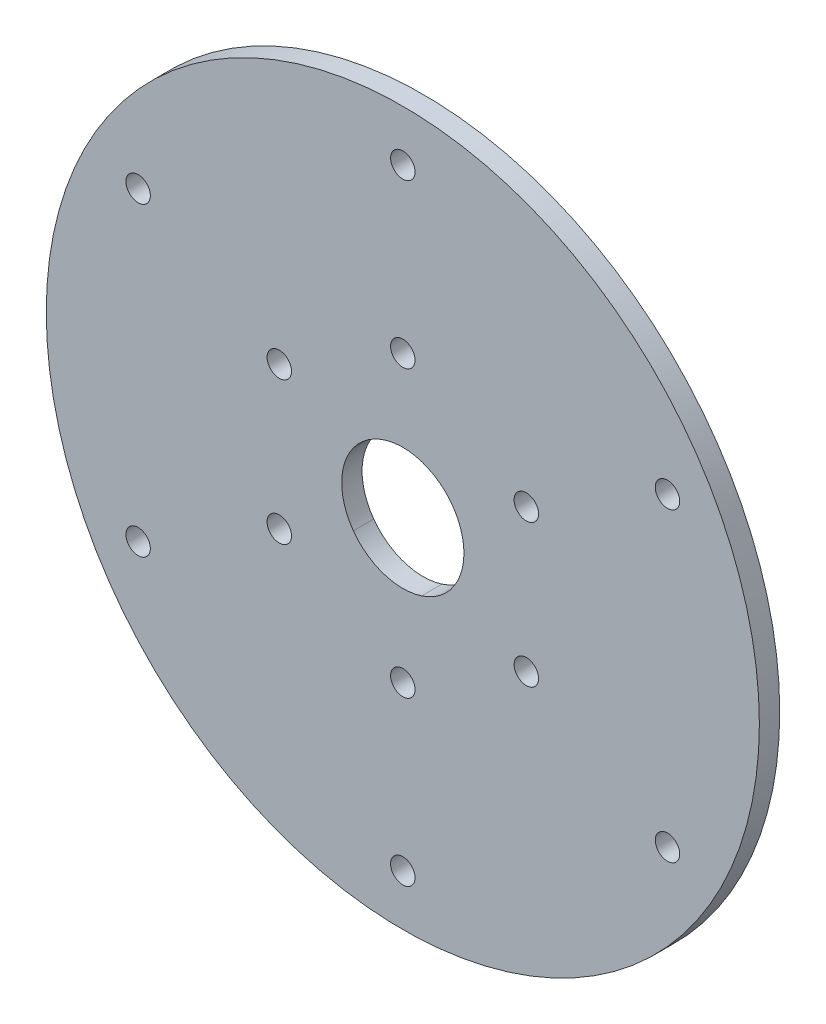
ISO-10303-21;
HEADER;
FILE_DESCRIPTION(('STEP AP214'),'2;1');
FILE_NAME('part.step','',(''),(''),'','','');
FILE_SCHEMA(('AUTOMOTIVE_DESIGN { 1 0 10303 214 1 1 1 1 }'));
ENDSEC;
DATA;
#1=APPLICATION_CONTEXT('core data for automotive mechanical design processes');
#2=APPLICATION_PROTOCOL_DEFINITION('international standard','automotive_design',2000,#1);
#3=PRODUCT_CONTEXT('',#1,'mechanical');
#4=PRODUCT('Part','Part','',(#3));
#5=PRODUCT_RELATED_PRODUCT_CATEGORY('part','',(#4));
#6=PRODUCT_DEFINITION_FORMATION('','',#4);
#7=PRODUCT_DEFINITION_CONTEXT('part definition',#1,'design');
#8=PRODUCT_DEFINITION('design','',#6,#7);
#9=PRODUCT_DEFINITION_SHAPE('','',#8);
#10=(LENGTH_UNIT() NAMED_UNIT(*) SI_UNIT(.MILLI.,.METRE.));
#11=(NAMED_UNIT(*) PLANE_ANGLE_UNIT() SI_UNIT($,.RADIAN.));
#12=(NAMED_UNIT(*) SI_UNIT($,.STERADIAN.) SOLID_ANGLE_UNIT());
#13=UNCERTAINTY_MEASURE_WITH_UNIT(LENGTH_MEASURE(1.E-05),#10,'distance_accuracy_value','');
#14=(GEOMETRIC_REPRESENTATION_CONTEXT(3) GLOBAL_UNCERTAINTY_ASSIGNED_CONTEXT((#13)) GLOBAL_UNIT_ASSIGNED_CONTEXT((#10,
#11,#12)) REPRESENTATION_CONTEXT('',''));
#15=CARTESIAN_POINT('',(0.,0.,0.));
#16=DIRECTION('',(0.,0.,1.));
#17=DIRECTION('',(1.,0.,0.));
#18=AXIS2_PLACEMENT_3D('',#15,#16,#17);
#19=CARTESIAN_POINT('',(0.00111803398874989,0.000363271264002675,10.));
#20=DIRECTION('',(0.,0.,-1.));
#21=DIRECTION('',(-1.,0.,0.));
#22=AXIS2_PLACEMENT_3D('',#19,#20,#21);
#23=CYLINDRICAL_SURFACE('',#22,30.);
#24=CARTESIAN_POINT('',(0.00111803398874989,0.000363271264002675,0.));
#25=DIRECTION('',(0.,0.,1.));
#26=DIRECTION('',(1.,0.,0.));
#27=AXIS2_PLACEMENT_3D('',#24,#25,#26);
#28=CIRCLE('',#27,30.);
#29=CARTESIAN_POINT('',(9.27106884637913,-28.5315138477736,0.));
#30=VERTEX_POINT('',#29);
#31=CARTESIAN_POINT('',(30.0011180282306,0.000951056604623031,0.));
#32=VERTEX_POINT('',#31);
#33=EDGE_CURVE('E124',#30,#32,#28,.T.);
#34=ORIENTED_EDGE('',*,*,#33,.F.);
#35=DIRECTION('',(0.,0.,-1.));
#36=VECTOR('',#35,1.);
#37=CARTESIAN_POINT('',(9.27106884637913,-28.5315138477736,10.));
#38=LINE('',#37,#36);
#39=CARTESIAN_POINT('',(9.27106884637913,-28.5315138477736,10.));
#40=VERTEX_POINT('',#39);
#41=EDGE_CURVE('E11',#40,#30,#38,.T.);
#42=ORIENTED_EDGE('',*,*,#41,.F.);
#43=CARTESIAN_POINT('',(0.00111803398874989,0.000363271264002675,10.));
#44=DIRECTION('',(0.,0.,1.));
#45=DIRECTION('',(1.,0.,0.));
#46=AXIS2_PLACEMENT_3D('',#43,#44,#45);
#47=CIRCLE('',#46,30.);
#48=CARTESIAN_POINT('',(30.0011180282306,0.000951056604623031,10.));
#49=VERTEX_POINT('',#48);
#50=EDGE_CURVE('E145',#40,#49,#47,.T.);
#51=ORIENTED_EDGE('',*,*,#50,.T.);
#52=DIRECTION('',(0.,0.,-1.));
#53=VECTOR('',#52,1.);
#54=CARTESIAN_POINT('',(30.0011180282306,0.000951056604623031,10.));
#55=LINE('',#54,#53);
#56=EDGE_CURVE('E58',#49,#32,#55,.T.);
#57=ORIENTED_EDGE('',*,*,#56,.T.);
#58=EDGE_LOOP('',(#34,#42,#51,#57));
#59=FACE_BOUND('',#58,.T.);
#60=ADVANCED_FACE('F41',(#59),#23,.F.);
#61=CARTESIAN_POINT('',(0.,0.,10.));
#62=DIRECTION('',(0.,0.,-1.));
#63=DIRECTION('',(-1.,0.,0.));
#64=AXIS2_PLACEMENT_3D('',#61,#62,#63);
#65=CYLINDRICAL_SURFACE('',#64,30.);
#66=CARTESIAN_POINT('',(0.,0.,0.));
#67=DIRECTION('',(0.,0.,1.));
#68=DIRECTION('',(1.,0.,0.));
#69=AXIS2_PLACEMENT_3D('',#66,#67,#68);
#70=CIRCLE('',#69,30.);
#71=CARTESIAN_POINT('',(-24.2708553180407,-17.6330820372031,0.));
#72=VERTEX_POINT('',#71);
#73=EDGE_CURVE('E127',#72,#30,#70,.T.);
#74=ORIENTED_EDGE('',*,*,#73,.F.);
#75=DIRECTION('',(0.,0.,-1.));
#76=VECTOR('',#75,1.);
#77=CARTESIAN_POINT('',(-24.2708553180407,-17.6330820372031,10.));
#78=LINE('',#77,#76);
#79=CARTESIAN_POINT('',(-24.2708553180407,-17.6330820372031,10.));
#80=VERTEX_POINT('',#79);
#81=EDGE_CURVE('E50',#80,#72,#78,.T.);
#82=ORIENTED_EDGE('',*,*,#81,.F.);
#83=CARTESIAN_POINT('',(0.,0.,10.));
#84=DIRECTION('',(0.,0.,1.));
#85=DIRECTION('',(1.,0.,0.));
#86=AXIS2_PLACEMENT_3D('',#83,#84,#85);
#87=CIRCLE('',#86,30.);
#88=EDGE_CURVE('E109',#80,#40,#87,.T.);
#89=ORIENTED_EDGE('',*,*,#88,.T.);
#90=ORIENTED_EDGE('',*,*,#41,.T.);
#91=EDGE_LOOP('',(#74,#82,#89,#90));
#92=FACE_BOUND('',#91,.T.);
#93=ADVANCED_FACE('F152',(#92),#65,.F.);
#94=CARTESIAN_POINT('',(-0.000690983005625056,0.000951056516295156,10.));
#95=DIRECTION('',(0.,0.,-1.));
#96=DIRECTION('',(-1.,0.,0.));
#97=AXIS2_PLACEMENT_3D('',#94,#95,#96);
#98=CYLINDRICAL_SURFACE('',#97,30.);
#99=CARTESIAN_POINT('',(-0.000690983005625056,0.000951056516295156,0.));
#100=DIRECTION('',(0.,0.,1.));
#101=DIRECTION('',(1.,0.,0.));
#102=AXIS2_PLACEMENT_3D('',#99,#100,#101);
#103=CIRCLE('',#102,30.);
#104=CARTESIAN_POINT('',(-24.2708553180927,17.6349841501641,0.));
#105=VERTEX_POINT('',#104);
#106=EDGE_CURVE('E95',#105,#72,#103,.T.);
#107=ORIENTED_EDGE('',*,*,#106,.F.);
#108=DIRECTION('',(0.,0.,-1.));
#109=VECTOR('',#108,1.);
#110=CARTESIAN_POINT('',(-24.2708553180927,17.6349841501641,10.));
#111=LINE('',#110,#109);
#112=CARTESIAN_POINT('',(-24.2708553180927,17.6349841501641,10.));
#113=VERTEX_POINT('',#112);
#114=EDGE_CURVE('E90',#113,#105,#111,.T.);
#115=ORIENTED_EDGE('',*,*,#114,.F.);
#116=CARTESIAN_POINT('',(-0.000690983005625056,0.000951056516295156,10.));
#117=DIRECTION('',(0.,0.,1.));
#118=DIRECTION('',(1.,0.,0.));
#119=AXIS2_PLACEMENT_3D('',#116,#117,#118);
#120=CIRCLE('',#119,30.);
#121=EDGE_CURVE('E93',#113,#80,#120,.T.);
#122=ORIENTED_EDGE('',*,*,#121,.T.);
#123=ORIENTED_EDGE('',*,*,#81,.T.);
#124=EDGE_LOOP('',(#107,#115,#122,#123));
#125=FACE_BOUND('',#124,.T.);
#126=ADVANCED_FACE('F92',(#125),#98,.F.);
#127=CARTESIAN_POINT('',(0.,0.00190211303259031,10.));
#128=DIRECTION('',(0.,0.,-1.));
#129=DIRECTION('',(-1.,0.,0.));
#130=AXIS2_PLACEMENT_3D('',#127,#128,#129);
#131=CYLINDRICAL_SURFACE('',#130,30.);
#132=CARTESIAN_POINT('',(0.,0.00190211303259031,0.));
#133=DIRECTION('',(0.,0.,1.));
#134=DIRECTION('',(1.,0.,0.));
#135=AXIS2_PLACEMENT_3D('',#132,#133,#134);
#136=CIRCLE('',#135,30.);
#137=CARTESIAN_POINT('',(9.27106884654775,28.5334159607514,0.));
#138=VERTEX_POINT('',#137);
#139=EDGE_CURVE('E134',#138,#105,#136,.T.);
#140=ORIENTED_EDGE('',*,*,#139,.F.);
#141=DIRECTION('',(0.,0.,-1.));
#142=VECTOR('',#141,1.);
#143=CARTESIAN_POINT('',(9.27106884654775,28.5334159607514,10.));
#144=LINE('',#143,#142);
#145=CARTESIAN_POINT('',(9.27106884654775,28.5334159607514,10.));
#146=VERTEX_POINT('',#145);
#147=EDGE_CURVE('E74',#146,#138,#144,.T.);
#148=ORIENTED_EDGE('',*,*,#147,.F.);
#149=CARTESIAN_POINT('',(0.,0.00190211303259031,10.));
#150=DIRECTION('',(0.,0.,1.));
#151=DIRECTION('',(1.,0.,0.));
#152=AXIS2_PLACEMENT_3D('',#149,#150,#151);
#153=CIRCLE('',#152,30.);
#154=EDGE_CURVE('E107',#146,#113,#153,.T.);
#155=ORIENTED_EDGE('',*,*,#154,.T.);
#156=ORIENTED_EDGE('',*,*,#114,.T.);
#157=EDGE_LOOP('',(#140,#148,#155,#156));
#158=FACE_BOUND('',#157,.T.);
#159=ADVANCED_FACE('F112',(#158),#131,.F.);
#160=CARTESIAN_POINT('',(0.0011180339887499,0.00153884176858762,10.));
#161=DIRECTION('',(0.,0.,-1.));
#162=DIRECTION('',(-1.,0.,0.));
#163=AXIS2_PLACEMENT_3D('',#160,#161,#162);
#164=CYLINDRICAL_SURFACE('',#163,30.);
#165=CARTESIAN_POINT('',(0.0011180339887499,0.00153884176858762,0.));
#166=DIRECTION('',(0.,0.,1.));
#167=DIRECTION('',(1.,0.,0.));
#168=AXIS2_PLACEMENT_3D('',#165,#166,#167);
#169=CIRCLE('',#168,30.);
#170=EDGE_CURVE('E137',#32,#138,#169,.T.);
#171=ORIENTED_EDGE('',*,*,#170,.F.);
#172=ORIENTED_EDGE('',*,*,#56,.F.);
#173=CARTESIAN_POINT('',(0.0011180339887499,0.00153884176858762,10.));
#174=DIRECTION('',(0.,0.,1.));
#175=DIRECTION('',(1.,0.,0.));
#176=AXIS2_PLACEMENT_3D('',#173,#174,#175);
#177=CIRCLE('',#176,30.);
#178=EDGE_CURVE('E114',#49,#146,#177,.T.);
#179=ORIENTED_EDGE('',*,*,#178,.T.);
#180=ORIENTED_EDGE('',*,*,#147,.T.);
#181=EDGE_LOOP('',(#171,#172,#179,#180));
#182=FACE_BOUND('',#181,.T.);
#183=ADVANCED_FACE('F156',(#182),#164,.F.);
#184=CARTESIAN_POINT('',(0.,0.,10.));
#185=DIRECTION('',(0.,0.,-1.));
#186=DIRECTION('',(-1.,0.,0.));
#187=AXIS2_PLACEMENT_3D('',#184,#185,#186);
#188=CYLINDRICAL_SURFACE('',#187,175.);
#189=CARTESIAN_POINT('',(0.,0.,10.));
#190=DIRECTION('',(0.,0.,1.));
#191=DIRECTION('',(1.,0.,0.));
#192=AXIS2_PLACEMENT_3D('',#189,#190,#191);
#193=CIRCLE('',#192,175.);
#194=CARTESIAN_POINT('',(175.,0.,10.));
#195=VERTEX_POINT('',#194);
#196=EDGE_CURVE('E117',#195,#195,#193,.T.);
#197=ORIENTED_EDGE('',*,*,#196,.F.);
#198=EDGE_LOOP('',(#197));
#199=FACE_BOUND('',#198,.T.);
#200=CARTESIAN_POINT('',(0.,0.,0.));
#201=DIRECTION('',(0.,0.,1.));
#202=DIRECTION('',(1.,0.,0.));
#203=AXIS2_PLACEMENT_3D('',#200,#201,#202);
#204=CIRCLE('',#203,175.);
#205=CARTESIAN_POINT('',(175.,0.,0.));
#206=VERTEX_POINT('',#205);
#207=EDGE_CURVE('E141',#206,#206,#204,.T.);
#208=ORIENTED_EDGE('',*,*,#207,.T.);
#209=EDGE_LOOP('',(#208));
#210=FACE_BOUND('',#209,.T.);
#211=ADVANCED_FACE('F158',(#199,#210),#188,.T.);
#212=CARTESIAN_POINT('',(0.,0.,10.));
#213=DIRECTION('',(0.,0.,1.));
#214=DIRECTION('',(1.,0.,0.));
#215=AXIS2_PLACEMENT_3D('',#212,#213,#214);
#216=PLANE('',#215);
#217=CARTESIAN_POINT('',(0.,-150.,10.));
#218=DIRECTION('',(0.,0.,-1.));
#219=DIRECTION('',(1.,0.,0.));
#220=AXIS2_PLACEMENT_3D('',#217,#218,#219);
#221=CIRCLE('',#220,6.00000000000001);
#222=CARTESIAN_POINT('',(6.00000000000001,-150.,10.));
#223=VERTEX_POINT('',#222);
#224=EDGE_CURVE('E336',#223,#223,#221,.T.);
#225=ORIENTED_EDGE('',*,*,#224,.T.);
#226=EDGE_LOOP('',(#225));
#227=FACE_BOUND('',#226,.T.);
#228=CARTESIAN_POINT('',(60.621778264911,-34.9999999999994,10.));
#229=DIRECTION('',(0.,0.,-1.));
#230=DIRECTION('',(0.499999999999992,0.866025403784443,0.));
#231=AXIS2_PLACEMENT_3D('',#228,#229,#230);
#232=CIRCLE('',#231,6.00000000000001);
#233=CARTESIAN_POINT('',(63.621778264911,-29.8038475772928,10.));
#234=VERTEX_POINT('',#233);
#235=EDGE_CURVE('E341',#234,#234,#232,.T.);
#236=ORIENTED_EDGE('',*,*,#235,.T.);
#237=EDGE_LOOP('',(#236));
#238=FACE_BOUND('',#237,.T.);
#239=CARTESIAN_POINT('',(129.903810567667,-74.9999999999988,10.));
#240=DIRECTION('',(0.,0.,-1.));
#241=DIRECTION('',(0.499999999999992,0.866025403784443,0.));
#242=AXIS2_PLACEMENT_3D('',#239,#240,#241);
#243=CIRCLE('',#242,6.00000000000001);
#244=CARTESIAN_POINT('',(132.903810567666,-69.8038475772921,10.));
#245=VERTEX_POINT('',#244);
#246=EDGE_CURVE('E355',#245,#245,#243,.T.);
#247=ORIENTED_EDGE('',*,*,#246,.T.);
#248=EDGE_LOOP('',(#247));
#249=FACE_BOUND('',#248,.T.);
#250=CARTESIAN_POINT('',(60.6217782649103,35.0000000000007,10.));
#251=DIRECTION('',(0.,0.,-1.));
#252=DIRECTION('',(-0.50000000000001,0.866025403784433,0.));
#253=AXIS2_PLACEMENT_3D('',#250,#251,#252);
#254=CIRCLE('',#253,6.00000000000001);
#255=CARTESIAN_POINT('',(57.6217782649102,40.1961524227073,10.));
#256=VERTEX_POINT('',#255);
#257=EDGE_CURVE('E457',#256,#256,#254,.T.);
#258=ORIENTED_EDGE('',*,*,#257,.T.);
#259=EDGE_LOOP('',(#258));
#260=FACE_BOUND('',#259,.T.);
#261=CARTESIAN_POINT('',(129.903810567665,75.0000000000015,10.));
#262=DIRECTION('',(0.,0.,-1.));
#263=DIRECTION('',(-0.50000000000001,0.866025403784433,0.));
#264=AXIS2_PLACEMENT_3D('',#261,#262,#263);
#265=CIRCLE('',#264,6.00000000000001);
#266=CARTESIAN_POINT('',(126.903810567665,80.1961524227081,10.));
#267=VERTEX_POINT('',#266);
#268=EDGE_CURVE('E467',#267,#267,#265,.T.);
#269=ORIENTED_EDGE('',*,*,#268,.T.);
#270=EDGE_LOOP('',(#269));
#271=FACE_BOUND('',#270,.T.);
#272=CARTESIAN_POINT('',(0.,-70.,10.));
#273=DIRECTION('',(0.,0.,-1.));
#274=DIRECTION('',(1.,0.,0.));
#275=AXIS2_PLACEMENT_3D('',#272,#273,#274);
#276=CIRCLE('',#275,6.00000000000001);
#277=CARTESIAN_POINT('',(6.00000000000001,-70.,10.));
#278=VERTEX_POINT('',#277);
#279=EDGE_CURVE('E381',#278,#278,#276,.T.);
#280=ORIENTED_EDGE('',*,*,#279,.T.);
#281=EDGE_LOOP('',(#280));
#282=FACE_BOUND('',#281,.T.);
#283=CARTESIAN_POINT('',(-129.903810567665,-75.0000000000006,10.));
#284=DIRECTION('',(0.,0.,-1.));
#285=DIRECTION('',(0.500000000000004,-0.866025403784436,0.));
#286=AXIS2_PLACEMENT_3D('',#283,#284,#285);
#287=CIRCLE('',#286,6.00000000000001);
#288=CARTESIAN_POINT('',(-126.903810567665,-80.1961524227073,10.));
#289=VERTEX_POINT('',#288);
#290=EDGE_CURVE('E373',#289,#289,#287,.T.);
#291=ORIENTED_EDGE('',*,*,#290,.T.);
#292=EDGE_LOOP('',(#291));
#293=FACE_BOUND('',#292,.T.);
#294=CARTESIAN_POINT('',(-60.6217782649106,-35.0000000000003,10.));
#295=DIRECTION('',(0.,0.,-1.));
#296=DIRECTION('',(0.500000000000004,-0.866025403784436,0.));
#297=AXIS2_PLACEMENT_3D('',#294,#295,#296);
#298=CIRCLE('',#297,6.00000000000001);
#299=CARTESIAN_POINT('',(-57.6217782649105,-40.1961524227069,10.));
#300=VERTEX_POINT('',#299);
#301=EDGE_CURVE('E365',#300,#300,#298,.T.);
#302=ORIENTED_EDGE('',*,*,#301,.T.);
#303=EDGE_LOOP('',(#302));
#304=FACE_BOUND('',#303,.T.);
#305=CARTESIAN_POINT('',(-129.903810567666,74.9999999999997,10.));
#306=DIRECTION('',(0.,0.,-1.));
#307=DIRECTION('',(-0.499999999999998,-0.86602540378444,0.));
#308=AXIS2_PLACEMENT_3D('',#305,#306,#307);
#309=CIRCLE('',#308,6.00000000000001);
#310=CARTESIAN_POINT('',(-132.903810567666,69.8038475772931,10.));
#311=VERTEX_POINT('',#310);
#312=EDGE_CURVE('E356',#311,#311,#309,.T.);
#313=ORIENTED_EDGE('',*,*,#312,.T.);
#314=EDGE_LOOP('',(#313));
#315=FACE_BOUND('',#314,.T.);
#316=CARTESIAN_POINT('',(-60.6217782649108,34.9999999999999,10.));
#317=DIRECTION('',(0.,0.,-1.));
#318=DIRECTION('',(-0.499999999999998,-0.86602540378444,0.));
#319=AXIS2_PLACEMENT_3D('',#316,#317,#318);
#320=CIRCLE('',#319,6.00000000000001);
#321=CARTESIAN_POINT('',(-63.6217782649108,29.8038475772932,10.));
#322=VERTEX_POINT('',#321);
#323=EDGE_CURVE('E388',#322,#322,#320,.T.);
#324=ORIENTED_EDGE('',*,*,#323,.T.);
#325=EDGE_LOOP('',(#324));
#326=FACE_BOUND('',#325,.T.);
#327=CARTESIAN_POINT('',(0.,150.,10.));
#328=DIRECTION('',(0.,0.,-1.));
#329=DIRECTION('',(-1.,0.,0.));
#330=AXIS2_PLACEMENT_3D('',#327,#328,#329);
#331=CIRCLE('',#330,6.00000000000001);
#332=CARTESIAN_POINT('',(-6.00000000000001,150.,10.));
#333=VERTEX_POINT('',#332);
#334=EDGE_CURVE('E396',#333,#333,#331,.T.);
#335=ORIENTED_EDGE('',*,*,#334,.T.);
#336=EDGE_LOOP('',(#335));
#337=FACE_BOUND('',#336,.T.);
#338=CARTESIAN_POINT('',(0.,70.,10.));
#339=DIRECTION('',(0.,0.,-1.));
#340=DIRECTION('',(-1.,0.,0.));
#341=AXIS2_PLACEMENT_3D('',#338,#339,#340);
#342=CIRCLE('',#341,6.00000000000001);
#343=CARTESIAN_POINT('',(-6.00000000000001,70.,10.));
#344=VERTEX_POINT('',#343);
#345=EDGE_CURVE('E128',#344,#344,#342,.T.);
#346=ORIENTED_EDGE('',*,*,#345,.T.);
#347=EDGE_LOOP('',(#346));
#348=FACE_BOUND('',#347,.T.);
#349=ORIENTED_EDGE('',*,*,#50,.F.);
#350=ORIENTED_EDGE('',*,*,#88,.F.);
#351=ORIENTED_EDGE('',*,*,#121,.F.);
#352=ORIENTED_EDGE('',*,*,#154,.F.);
#353=ORIENTED_EDGE('',*,*,#178,.F.);
#354=EDGE_LOOP('',(#349,#350,#351,#352,#353));
#355=FACE_BOUND('',#354,.T.);
#356=ORIENTED_EDGE('',*,*,#196,.T.);
#357=EDGE_LOOP('',(#356));
#358=FACE_BOUND('',#357,.T.);
#359=ADVANCED_FACE('F104',(#227,#238,#249,#260,#271,#282,#293,#304,#315,#326,#337,#348,#355,
#358),#216,.T.);
#360=CARTESIAN_POINT('',(0.,0.,0.));
#361=DIRECTION('',(0.,0.,1.));
#362=DIRECTION('',(1.,0.,0.));
#363=AXIS2_PLACEMENT_3D('',#360,#361,#362);
#364=PLANE('',#363);
#365=CARTESIAN_POINT('',(0.,-150.,0.));
#366=DIRECTION('',(0.,0.,-1.));
#367=DIRECTION('',(1.,0.,0.));
#368=AXIS2_PLACEMENT_3D('',#365,#366,#367);
#369=CIRCLE('',#368,6.00000000000001);
#370=CARTESIAN_POINT('',(6.00000000000001,-150.,0.));
#371=VERTEX_POINT('',#370);
#372=EDGE_CURVE('E339',#371,#371,#369,.T.);
#373=ORIENTED_EDGE('',*,*,#372,.F.);
#374=EDGE_LOOP('',(#373));
#375=FACE_BOUND('',#374,.T.);
#376=CARTESIAN_POINT('',(60.621778264911,-34.9999999999994,0.));
#377=DIRECTION('',(0.,0.,-1.));
#378=DIRECTION('',(0.499999999999992,0.866025403784443,0.));
#379=AXIS2_PLACEMENT_3D('',#376,#377,#378);
#380=CIRCLE('',#379,6.00000000000001);
#381=CARTESIAN_POINT('',(63.621778264911,-29.8038475772928,0.));
#382=VERTEX_POINT('',#381);
#383=EDGE_CURVE('E348',#382,#382,#380,.T.);
#384=ORIENTED_EDGE('',*,*,#383,.F.);
#385=EDGE_LOOP('',(#384));
#386=FACE_BOUND('',#385,.T.);
#387=CARTESIAN_POINT('',(129.903810567667,-74.9999999999988,0.));
#388=DIRECTION('',(0.,0.,-1.));
#389=DIRECTION('',(0.499999999999992,0.866025403784443,0.));
#390=AXIS2_PLACEMENT_3D('',#387,#388,#389);
#391=CIRCLE('',#390,6.00000000000001);
#392=CARTESIAN_POINT('',(132.903810567666,-69.8038475772921,0.));
#393=VERTEX_POINT('',#392);
#394=EDGE_CURVE('E451',#393,#393,#391,.T.);
#395=ORIENTED_EDGE('',*,*,#394,.F.);
#396=EDGE_LOOP('',(#395));
#397=FACE_BOUND('',#396,.T.);
#398=CARTESIAN_POINT('',(60.6217782649103,35.0000000000007,0.));
#399=DIRECTION('',(0.,0.,-1.));
#400=DIRECTION('',(-0.50000000000001,0.866025403784433,0.));
#401=AXIS2_PLACEMENT_3D('',#398,#399,#400);
#402=CIRCLE('',#401,6.00000000000001);
#403=CARTESIAN_POINT('',(57.6217782649102,40.1961524227073,0.));
#404=VERTEX_POINT('',#403);
#405=EDGE_CURVE('E463',#404,#404,#402,.T.);
#406=ORIENTED_EDGE('',*,*,#405,.F.);
#407=EDGE_LOOP('',(#406));
#408=FACE_BOUND('',#407,.T.);
#409=CARTESIAN_POINT('',(129.903810567665,75.0000000000015,0.));
#410=DIRECTION('',(0.,0.,-1.));
#411=DIRECTION('',(-0.50000000000001,0.866025403784433,0.));
#412=AXIS2_PLACEMENT_3D('',#409,#410,#411);
#413=CIRCLE('',#412,6.00000000000001);
#414=CARTESIAN_POINT('',(126.903810567665,80.1961524227081,0.));
#415=VERTEX_POINT('',#414);
#416=EDGE_CURVE('E470',#415,#415,#413,.T.);
#417=ORIENTED_EDGE('',*,*,#416,.F.);
#418=EDGE_LOOP('',(#417));
#419=FACE_BOUND('',#418,.T.);
#420=CARTESIAN_POINT('',(0.,-70.,0.));
#421=DIRECTION('',(0.,0.,-1.));
#422=DIRECTION('',(1.,0.,0.));
#423=AXIS2_PLACEMENT_3D('',#420,#421,#422);
#424=CIRCLE('',#423,6.00000000000001);
#425=CARTESIAN_POINT('',(6.00000000000001,-70.,0.));
#426=VERTEX_POINT('',#425);
#427=EDGE_CURVE('E345',#426,#426,#424,.T.);
#428=ORIENTED_EDGE('',*,*,#427,.F.);
#429=EDGE_LOOP('',(#428));
#430=FACE_BOUND('',#429,.T.);
#431=CARTESIAN_POINT('',(-129.903810567665,-75.0000000000006,0.));
#432=DIRECTION('',(0.,0.,-1.));
#433=DIRECTION('',(0.500000000000004,-0.866025403784436,0.));
#434=AXIS2_PLACEMENT_3D('',#431,#432,#433);
#435=CIRCLE('',#434,6.00000000000001);
#436=CARTESIAN_POINT('',(-126.903810567665,-80.1961524227073,0.));
#437=VERTEX_POINT('',#436);
#438=EDGE_CURVE('E377',#437,#437,#435,.T.);
#439=ORIENTED_EDGE('',*,*,#438,.F.);
#440=EDGE_LOOP('',(#439));
#441=FACE_BOUND('',#440,.T.);
#442=CARTESIAN_POINT('',(-60.6217782649106,-35.0000000000003,0.));
#443=DIRECTION('',(0.,0.,-1.));
#444=DIRECTION('',(0.500000000000004,-0.866025403784436,0.));
#445=AXIS2_PLACEMENT_3D('',#442,#443,#444);
#446=CIRCLE('',#445,6.00000000000001);
#447=CARTESIAN_POINT('',(-57.6217782649105,-40.1961524227069,0.));
#448=VERTEX_POINT('',#447);
#449=EDGE_CURVE('E369',#448,#448,#446,.T.);
#450=ORIENTED_EDGE('',*,*,#449,.F.);
#451=EDGE_LOOP('',(#450));
#452=FACE_BOUND('',#451,.T.);
#453=CARTESIAN_POINT('',(-129.903810567666,74.9999999999997,0.));
#454=DIRECTION('',(0.,0.,-1.));
#455=DIRECTION('',(-0.499999999999998,-0.86602540378444,0.));
#456=AXIS2_PLACEMENT_3D('',#453,#454,#455);
#457=CIRCLE('',#456,6.00000000000001);
#458=CARTESIAN_POINT('',(-132.903810567666,69.8038475772931,0.));
#459=VERTEX_POINT('',#458);
#460=EDGE_CURVE('E361',#459,#459,#457,.T.);
#461=ORIENTED_EDGE('',*,*,#460,.F.);
#462=EDGE_LOOP('',(#461));
#463=FACE_BOUND('',#462,.T.);
#464=CARTESIAN_POINT('',(-60.6217782649108,34.9999999999999,0.));
#465=DIRECTION('',(0.,0.,-1.));
#466=DIRECTION('',(-0.499999999999998,-0.86602540378444,0.));
#467=AXIS2_PLACEMENT_3D('',#464,#465,#466);
#468=CIRCLE('',#467,6.00000000000001);
#469=CARTESIAN_POINT('',(-63.6217782649108,29.8038475772932,0.));
#470=VERTEX_POINT('',#469);
#471=EDGE_CURVE('E360',#470,#470,#468,.T.);
#472=ORIENTED_EDGE('',*,*,#471,.F.);
#473=EDGE_LOOP('',(#472));
#474=FACE_BOUND('',#473,.T.);
#475=CARTESIAN_POINT('',(0.,150.,0.));
#476=DIRECTION('',(0.,0.,-1.));
#477=DIRECTION('',(-1.,0.,0.));
#478=AXIS2_PLACEMENT_3D('',#475,#476,#477);
#479=CIRCLE('',#478,6.00000000000001);
#480=CARTESIAN_POINT('',(-6.00000000000001,150.,0.));
#481=VERTEX_POINT('',#480);
#482=EDGE_CURVE('E392',#481,#481,#479,.T.);
#483=ORIENTED_EDGE('',*,*,#482,.F.);
#484=EDGE_LOOP('',(#483));
#485=FACE_BOUND('',#484,.T.);
#486=CARTESIAN_POINT('',(0.,70.,0.));
#487=DIRECTION('',(0.,0.,-1.));
#488=DIRECTION('',(-1.,0.,0.));
#489=AXIS2_PLACEMENT_3D('',#486,#487,#488);
#490=CIRCLE('',#489,6.00000000000001);
#491=CARTESIAN_POINT('',(-6.00000000000001,70.,0.));
#492=VERTEX_POINT('',#491);
#493=EDGE_CURVE('E400',#492,#492,#490,.T.);
#494=ORIENTED_EDGE('',*,*,#493,.F.);
#495=EDGE_LOOP('',(#494));
#496=FACE_BOUND('',#495,.T.);
#497=ORIENTED_EDGE('',*,*,#33,.T.);
#498=ORIENTED_EDGE('',*,*,#170,.T.);
#499=ORIENTED_EDGE('',*,*,#139,.T.);
#500=ORIENTED_EDGE('',*,*,#106,.T.);
#501=ORIENTED_EDGE('',*,*,#73,.T.);
#502=EDGE_LOOP('',(#497,#498,#499,#500,#501));
#503=FACE_BOUND('',#502,.T.);
#504=ORIENTED_EDGE('',*,*,#207,.F.);
#505=EDGE_LOOP('',(#504));
#506=FACE_BOUND('',#505,.T.);
#507=ADVANCED_FACE('F154',(#375,#386,#397,#408,#419,#430,#441,#452,#463,#474,#485,#496,#503,
#506),#364,.F.);
#508=CARTESIAN_POINT('',(0.,70.,10.));
#509=DIRECTION('',(0.,0.,-1.));
#510=DIRECTION('',(-1.,0.,0.));
#511=AXIS2_PLACEMENT_3D('',#508,#509,#510);
#512=CYLINDRICAL_SURFACE('',#511,6.00000000000001);
#513=ORIENTED_EDGE('',*,*,#345,.F.);
#514=EDGE_LOOP('',(#513));
#515=FACE_BOUND('',#514,.T.);
#516=ORIENTED_EDGE('',*,*,#493,.T.);
#517=EDGE_LOOP('',(#516));
#518=FACE_BOUND('',#517,.T.);
#519=ADVANCED_FACE('F198',(#515,#518),#512,.F.);
#520=CARTESIAN_POINT('',(0.,150.,10.));
#521=DIRECTION('',(0.,0.,-1.));
#522=DIRECTION('',(-1.,0.,0.));
#523=AXIS2_PLACEMENT_3D('',#520,#521,#522);
#524=CYLINDRICAL_SURFACE('',#523,6.00000000000001);
#525=ORIENTED_EDGE('',*,*,#334,.F.);
#526=EDGE_LOOP('',(#525));
#527=FACE_BOUND('',#526,.T.);
#528=ORIENTED_EDGE('',*,*,#482,.T.);
#529=EDGE_LOOP('',(#528));
#530=FACE_BOUND('',#529,.T.);
#531=ADVANCED_FACE('F203',(#527,#530),#524,.F.);
#532=CARTESIAN_POINT('',(-60.6217782649108,34.9999999999999,10.));
#533=DIRECTION('',(0.,0.,-1.));
#534=DIRECTION('',(-1.,0.,0.));
#535=AXIS2_PLACEMENT_3D('',#532,#533,#534);
#536=CYLINDRICAL_SURFACE('',#535,6.00000000000001);
#537=ORIENTED_EDGE('',*,*,#323,.F.);
#538=EDGE_LOOP('',(#537));
#539=FACE_BOUND('',#538,.T.);
#540=ORIENTED_EDGE('',*,*,#471,.T.);
#541=EDGE_LOOP('',(#540));
#542=FACE_BOUND('',#541,.T.);
#543=ADVANCED_FACE('F215',(#539,#542),#536,.F.);
#544=CARTESIAN_POINT('',(-129.903810567666,74.9999999999997,10.));
#545=DIRECTION('',(0.,0.,-1.));
#546=DIRECTION('',(-1.,0.,0.));
#547=AXIS2_PLACEMENT_3D('',#544,#545,#546);
#548=CYLINDRICAL_SURFACE('',#547,6.00000000000001);
#549=ORIENTED_EDGE('',*,*,#312,.F.);
#550=EDGE_LOOP('',(#549));
#551=FACE_BOUND('',#550,.T.);
#552=ORIENTED_EDGE('',*,*,#460,.T.);
#553=EDGE_LOOP('',(#552));
#554=FACE_BOUND('',#553,.T.);
#555=ADVANCED_FACE('F239',(#551,#554),#548,.F.);
#556=CARTESIAN_POINT('',(-60.6217782649106,-35.0000000000003,10.));
#557=DIRECTION('',(0.,0.,-1.));
#558=DIRECTION('',(-1.,0.,0.));
#559=AXIS2_PLACEMENT_3D('',#556,#557,#558);
#560=CYLINDRICAL_SURFACE('',#559,6.00000000000001);
#561=ORIENTED_EDGE('',*,*,#301,.F.);
#562=EDGE_LOOP('',(#561));
#563=FACE_BOUND('',#562,.T.);
#564=ORIENTED_EDGE('',*,*,#449,.T.);
#565=EDGE_LOOP('',(#564));
#566=FACE_BOUND('',#565,.T.);
#567=ADVANCED_FACE('F249',(#563,#566),#560,.F.);
#568=CARTESIAN_POINT('',(-129.903810567665,-75.0000000000006,10.));
#569=DIRECTION('',(0.,0.,-1.));
#570=DIRECTION('',(-1.,0.,0.));
#571=AXIS2_PLACEMENT_3D('',#568,#569,#570);
#572=CYLINDRICAL_SURFACE('',#571,6.00000000000001);
#573=ORIENTED_EDGE('',*,*,#290,.F.);
#574=EDGE_LOOP('',(#573));
#575=FACE_BOUND('',#574,.T.);
#576=ORIENTED_EDGE('',*,*,#438,.T.);
#577=EDGE_LOOP('',(#576));
#578=FACE_BOUND('',#577,.T.);
#579=ADVANCED_FACE('F259',(#575,#578),#572,.F.);
#580=CARTESIAN_POINT('',(0.,-70.,10.));
#581=DIRECTION('',(0.,0.,-1.));
#582=DIRECTION('',(-1.,0.,0.));
#583=AXIS2_PLACEMENT_3D('',#580,#581,#582);
#584=CYLINDRICAL_SURFACE('',#583,6.00000000000001);
#585=ORIENTED_EDGE('',*,*,#279,.F.);
#586=EDGE_LOOP('',(#585));
#587=FACE_BOUND('',#586,.T.);
#588=ORIENTED_EDGE('',*,*,#427,.T.);
#589=EDGE_LOOP('',(#588));
#590=FACE_BOUND('',#589,.T.);
#591=ADVANCED_FACE('F269',(#587,#590),#584,.F.);
#592=CARTESIAN_POINT('',(129.903810567665,75.0000000000015,10.));
#593=DIRECTION('',(0.,0.,-1.));
#594=DIRECTION('',(-1.,0.,0.));
#595=AXIS2_PLACEMENT_3D('',#592,#593,#594);
#596=CYLINDRICAL_SURFACE('',#595,6.00000000000001);
#597=ORIENTED_EDGE('',*,*,#268,.F.);
#598=EDGE_LOOP('',(#597));
#599=FACE_BOUND('',#598,.T.);
#600=ORIENTED_EDGE('',*,*,#416,.T.);
#601=EDGE_LOOP('',(#600));
#602=FACE_BOUND('',#601,.T.);
#603=ADVANCED_FACE('F279',(#599,#602),#596,.F.);
#604=CARTESIAN_POINT('',(60.6217782649103,35.0000000000007,10.));
#605=DIRECTION('',(0.,0.,-1.));
#606=DIRECTION('',(-1.,0.,0.));
#607=AXIS2_PLACEMENT_3D('',#604,#605,#606);
#608=CYLINDRICAL_SURFACE('',#607,6.00000000000001);
#609=ORIENTED_EDGE('',*,*,#257,.F.);
#610=EDGE_LOOP('',(#609));
#611=FACE_BOUND('',#610,.T.);
#612=ORIENTED_EDGE('',*,*,#405,.T.);
#613=EDGE_LOOP('',(#612));
#614=FACE_BOUND('',#613,.T.);
#615=ADVANCED_FACE('F289',(#611,#614),#608,.F.);
#616=CARTESIAN_POINT('',(129.903810567667,-74.9999999999988,10.));
#617=DIRECTION('',(0.,0.,-1.));
#618=DIRECTION('',(-1.,0.,0.));
#619=AXIS2_PLACEMENT_3D('',#616,#617,#618);
#620=CYLINDRICAL_SURFACE('',#619,6.00000000000001);
#621=ORIENTED_EDGE('',*,*,#246,.F.);
#622=EDGE_LOOP('',(#621));
#623=FACE_BOUND('',#622,.T.);
#624=ORIENTED_EDGE('',*,*,#394,.T.);
#625=EDGE_LOOP('',(#624));
#626=FACE_BOUND('',#625,.T.);
#627=ADVANCED_FACE('F299',(#623,#626),#620,.F.);
#628=CARTESIAN_POINT('',(60.621778264911,-34.9999999999994,10.));
#629=DIRECTION('',(0.,0.,-1.));
#630=DIRECTION('',(-1.,0.,0.));
#631=AXIS2_PLACEMENT_3D('',#628,#629,#630);
#632=CYLINDRICAL_SURFACE('',#631,6.00000000000001);
#633=ORIENTED_EDGE('',*,*,#235,.F.);
#634=EDGE_LOOP('',(#633));
#635=FACE_BOUND('',#634,.T.);
#636=ORIENTED_EDGE('',*,*,#383,.T.);
#637=EDGE_LOOP('',(#636));
#638=FACE_BOUND('',#637,.T.);
#639=ADVANCED_FACE('F309',(#635,#638),#632,.F.);
#640=CARTESIAN_POINT('',(0.,-150.,10.));
#641=DIRECTION('',(0.,0.,-1.));
#642=DIRECTION('',(-1.,0.,0.));
#643=AXIS2_PLACEMENT_3D('',#640,#641,#642);
#644=CYLINDRICAL_SURFACE('',#643,6.00000000000001);
#645=ORIENTED_EDGE('',*,*,#224,.F.);
#646=EDGE_LOOP('',(#645));
#647=FACE_BOUND('',#646,.T.);
#648=ORIENTED_EDGE('',*,*,#372,.T.);
#649=EDGE_LOOP('',(#648));
#650=FACE_BOUND('',#649,.T.);
#651=ADVANCED_FACE('F319',(#647,#650),#644,.F.);
#652=CLOSED_SHELL('',(#60,#93,#126,#159,#183,#211,#359,#507,#519,#531,#543,#555,#567,#579,#591,
#603,#615,#627,#639,#651));
#653=MANIFOLD_SOLID_BREP('B2',#652);
#654=ADVANCED_BREP_SHAPE_REPRESENTATION('',(#18,#653),#14);
#655=SHAPE_DEFINITION_REPRESENTATION(#9,#654);
ENDSEC;
END-ISO-10303-21;
